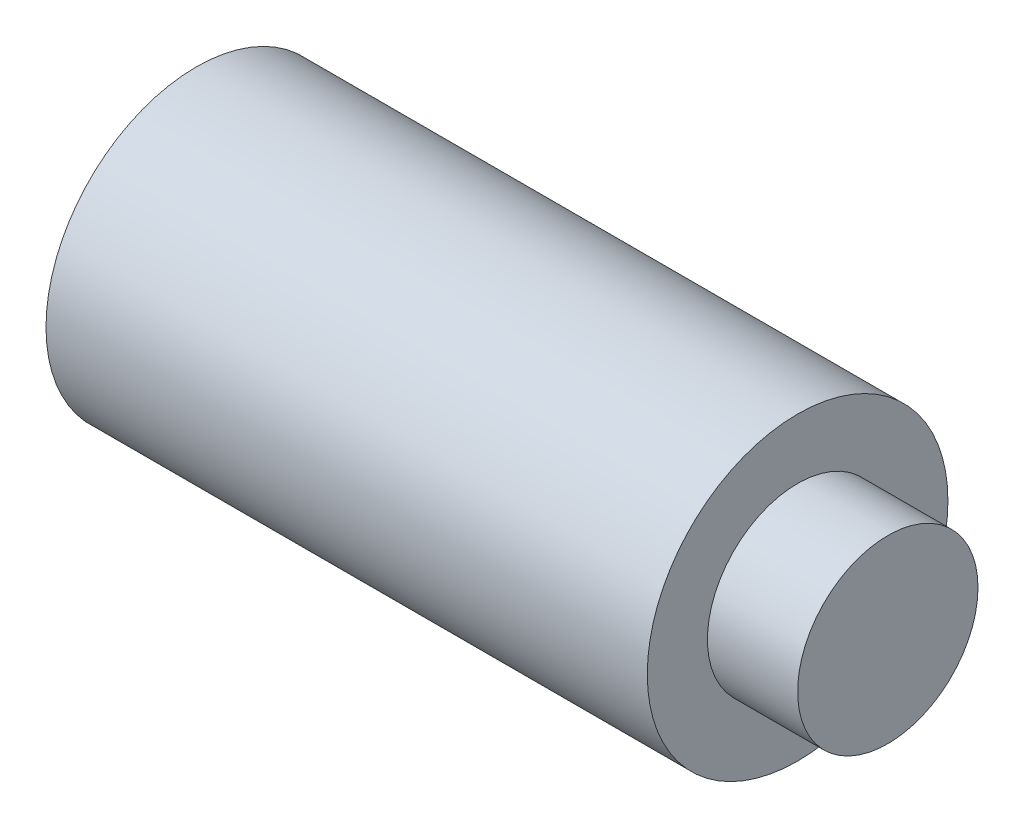
ISO-10303-21;
HEADER;
FILE_DESCRIPTION(('STEP AP214'),'2;1');
FILE_NAME('part.step','',(''),(''),'','','');
FILE_SCHEMA(('AUTOMOTIVE_DESIGN { 1 0 10303 214 1 1 1 1 }'));
ENDSEC;
DATA;
#1=APPLICATION_CONTEXT('core data for automotive mechanical design processes');
#2=APPLICATION_PROTOCOL_DEFINITION('international standard','automotive_design',2000,#1);
#3=PRODUCT_CONTEXT('',#1,'mechanical');
#4=PRODUCT('Part','Part','',(#3));
#5=PRODUCT_RELATED_PRODUCT_CATEGORY('part','',(#4));
#6=PRODUCT_DEFINITION_FORMATION('','',#4);
#7=PRODUCT_DEFINITION_CONTEXT('part definition',#1,'design');
#8=PRODUCT_DEFINITION('design','',#6,#7);
#9=PRODUCT_DEFINITION_SHAPE('','',#8);
#10=(LENGTH_UNIT() NAMED_UNIT(*) SI_UNIT(.MILLI.,.METRE.));
#11=(NAMED_UNIT(*) PLANE_ANGLE_UNIT() SI_UNIT($,.RADIAN.));
#12=(NAMED_UNIT(*) SI_UNIT($,.STERADIAN.) SOLID_ANGLE_UNIT());
#13=UNCERTAINTY_MEASURE_WITH_UNIT(LENGTH_MEASURE(1.E-05),#10,'distance_accuracy_value','');
#14=(GEOMETRIC_REPRESENTATION_CONTEXT(3) GLOBAL_UNCERTAINTY_ASSIGNED_CONTEXT((#13)) GLOBAL_UNIT_ASSIGNED_CONTEXT((#10,
#11,#12)) REPRESENTATION_CONTEXT('',''));
#15=CARTESIAN_POINT('',(0.,0.,0.));
#16=DIRECTION('',(0.,0.,1.));
#17=DIRECTION('',(1.,0.,0.));
#18=AXIS2_PLACEMENT_3D('',#15,#16,#17);
#19=CARTESIAN_POINT('',(5.,0.,0.));
#20=DIRECTION('',(-1.,0.,0.));
#21=DIRECTION('',(0.,0.,1.));
#22=AXIS2_PLACEMENT_3D('',#19,#20,#21);
#23=CYLINDRICAL_SURFACE('',#22,2.5);
#24=CARTESIAN_POINT('',(5.,0.,0.));
#25=DIRECTION('',(1.,0.,0.));
#26=DIRECTION('',(0.,0.,-1.));
#27=AXIS2_PLACEMENT_3D('',#24,#25,#26);
#28=CIRCLE('',#27,2.5);
#29=CARTESIAN_POINT('',(5.,0.,-2.5));
#30=VERTEX_POINT('',#29);
#31=EDGE_CURVE('E10',#30,#30,#28,.T.);
#32=ORIENTED_EDGE('',*,*,#31,.F.);
#33=EDGE_LOOP('',(#32));
#34=FACE_BOUND('',#33,.T.);
#35=CARTESIAN_POINT('',(-5.,0.,0.));
#36=DIRECTION('',(1.,0.,0.));
#37=DIRECTION('',(0.,0.,-1.));
#38=AXIS2_PLACEMENT_3D('',#35,#36,#37);
#39=CIRCLE('',#38,2.5);
#40=CARTESIAN_POINT('',(-5.,0.,-2.5));
#41=VERTEX_POINT('',#40);
#42=EDGE_CURVE('E51',#41,#41,#39,.T.);
#43=ORIENTED_EDGE('',*,*,#42,.T.);
#44=EDGE_LOOP('',(#43));
#45=FACE_BOUND('',#44,.T.);
#46=ADVANCED_FACE('F43',(#34,#45),#23,.T.);
#47=CARTESIAN_POINT('',(5.,0.,0.));
#48=DIRECTION('',(1.,0.,0.));
#49=DIRECTION('',(0.,0.,-1.));
#50=AXIS2_PLACEMENT_3D('',#47,#48,#49);
#51=PLANE('',#50);
#52=CARTESIAN_POINT('',(5.,0.,0.));
#53=DIRECTION('',(1.,0.,0.));
#54=DIRECTION('',(0.,0.,-1.));
#55=AXIS2_PLACEMENT_3D('',#52,#53,#54);
#56=CIRCLE('',#55,1.5);
#57=CARTESIAN_POINT('',(5.,0.,-1.5));
#58=VERTEX_POINT('',#57);
#59=EDGE_CURVE('E46',#58,#58,#56,.F.);
#60=ORIENTED_EDGE('',*,*,#59,.T.);
#61=EDGE_LOOP('',(#60));
#62=FACE_BOUND('',#61,.T.);
#63=ORIENTED_EDGE('',*,*,#31,.T.);
#64=EDGE_LOOP('',(#63));
#65=FACE_BOUND('',#64,.T.);
#66=ADVANCED_FACE('F96',(#62,#65),#51,.T.);
#67=CARTESIAN_POINT('',(-5.,0.,0.));
#68=DIRECTION('',(1.,0.,0.));
#69=DIRECTION('',(0.,0.,-1.));
#70=AXIS2_PLACEMENT_3D('',#67,#68,#69);
#71=PLANE('',#70);
#72=CARTESIAN_POINT('',(-5.,0.,0.));
#73=DIRECTION('',(1.,0.,0.));
#74=DIRECTION('',(0.,0.,-1.));
#75=AXIS2_PLACEMENT_3D('',#72,#73,#74);
#76=CIRCLE('',#75,1.5);
#77=CARTESIAN_POINT('',(-5.,0.,-1.5));
#78=VERTEX_POINT('',#77);
#79=EDGE_CURVE('E57',#78,#78,#76,.T.);
#80=ORIENTED_EDGE('',*,*,#79,.T.);
#81=EDGE_LOOP('',(#80));
#82=FACE_BOUND('',#81,.T.);
#83=ORIENTED_EDGE('',*,*,#42,.F.);
#84=EDGE_LOOP('',(#83));
#85=FACE_BOUND('',#84,.T.);
#86=ADVANCED_FACE('F101',(#82,#85),#71,.F.);
#87=CARTESIAN_POINT('',(-15.,0.,0.));
#88=DIRECTION('',(1.,0.,0.));
#89=DIRECTION('',(0.,0.,-1.));
#90=AXIS2_PLACEMENT_3D('',#87,#88,#89);
#91=CYLINDRICAL_SURFACE('',#90,1.5);
#92=CARTESIAN_POINT('',(0.,0.,0.));
#93=DIRECTION('',(1.,0.,0.));
#94=DIRECTION('',(0.,0.,-1.));
#95=AXIS2_PLACEMENT_3D('',#92,#93,#94);
#96=CIRCLE('',#95,1.5);
#97=CARTESIAN_POINT('',(0.,0.,-1.5));
#98=VERTEX_POINT('',#97);
#99=EDGE_CURVE('E60',#98,#98,#96,.T.);
#100=ORIENTED_EDGE('',*,*,#99,.T.);
#101=EDGE_LOOP('',(#100));
#102=FACE_BOUND('',#101,.T.);
#103=ORIENTED_EDGE('',*,*,#79,.F.);
#104=EDGE_LOOP('',(#103));
#105=FACE_BOUND('',#104,.T.);
#106=ADVANCED_FACE('F92',(#102,#105),#91,.F.);
#107=CARTESIAN_POINT('',(0.,0.,0.));
#108=DIRECTION('',(1.,0.,0.));
#109=DIRECTION('',(0.,0.,-1.));
#110=AXIS2_PLACEMENT_3D('',#107,#108,#109);
#111=PLANE('',#110);
#112=ORIENTED_EDGE('',*,*,#99,.F.);
#113=EDGE_LOOP('',(#112));
#114=FACE_BOUND('',#113,.T.);
#115=ADVANCED_FACE('F83',(#114),#111,.F.);
#116=CARTESIAN_POINT('',(6.5,0.,0.));
#117=DIRECTION('',(-1.,0.,0.));
#118=DIRECTION('',(0.,0.,1.));
#119=AXIS2_PLACEMENT_3D('',#116,#117,#118);
#120=CYLINDRICAL_SURFACE('',#119,1.5);
#121=ORIENTED_EDGE('',*,*,#59,.F.);
#122=EDGE_LOOP('',(#121));
#123=FACE_BOUND('',#122,.T.);
#124=CARTESIAN_POINT('',(6.5,0.,0.));
#125=DIRECTION('',(1.,0.,0.));
#126=DIRECTION('',(0.,0.,-1.));
#127=AXIS2_PLACEMENT_3D('',#124,#125,#126);
#128=CIRCLE('',#127,1.5);
#129=CARTESIAN_POINT('',(6.5,0.,-1.5));
#130=VERTEX_POINT('',#129);
#131=EDGE_CURVE('E72',#130,#130,#128,.T.);
#132=ORIENTED_EDGE('',*,*,#131,.F.);
#133=EDGE_LOOP('',(#132));
#134=FACE_BOUND('',#133,.T.);
#135=ADVANCED_FACE('F81',(#123,#134),#120,.T.);
#136=CARTESIAN_POINT('',(6.5,0.,0.));
#137=DIRECTION('',(1.,0.,0.));
#138=DIRECTION('',(0.,0.,-1.));
#139=AXIS2_PLACEMENT_3D('',#136,#137,#138);
#140=PLANE('',#139);
#141=ORIENTED_EDGE('',*,*,#131,.T.);
#142=EDGE_LOOP('',(#141));
#143=FACE_BOUND('',#142,.T.);
#144=ADVANCED_FACE('F79',(#143),#140,.T.);
#145=CLOSED_SHELL('',(#46,#66,#86,#106,#115,#135,#144));
#146=MANIFOLD_SOLID_BREP('B2',#145);
#147=ADVANCED_BREP_SHAPE_REPRESENTATION('',(#18,#146),#14);
#148=SHAPE_DEFINITION_REPRESENTATION(#9,#147);
ENDSEC;
END-ISO-10303-21;
